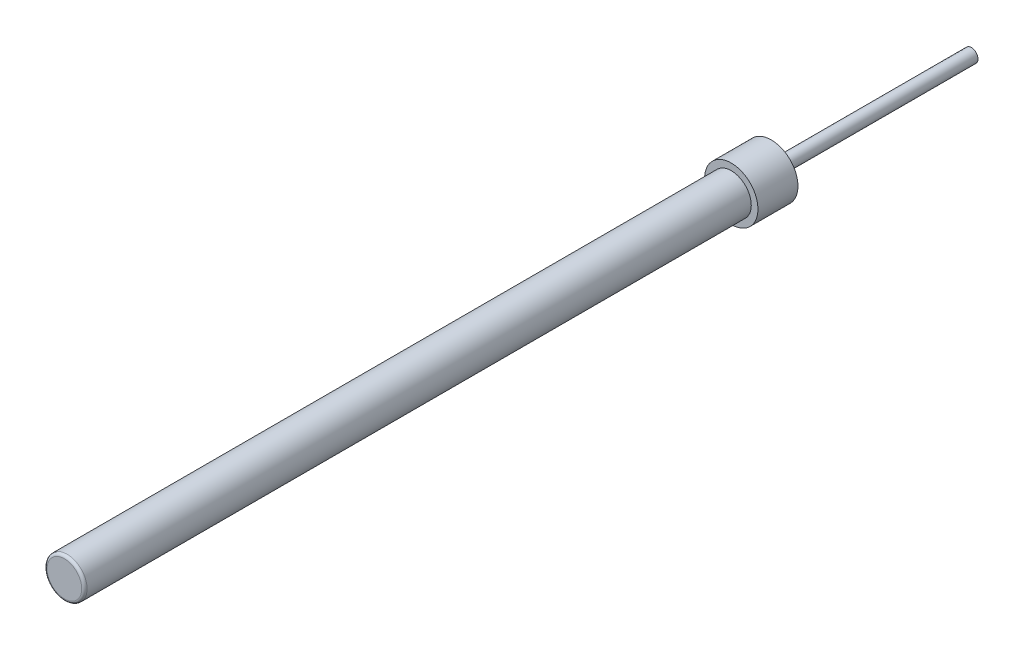
ISO-10303-21;
HEADER;
FILE_DESCRIPTION(('STEP AP214'),'2;1');
FILE_NAME('part.step','',(''),(''),'','','');
FILE_SCHEMA(('AUTOMOTIVE_DESIGN { 1 0 10303 214 1 1 1 1 }'));
ENDSEC;
DATA;
#1=APPLICATION_CONTEXT('core data for automotive mechanical design processes');
#2=APPLICATION_PROTOCOL_DEFINITION('international standard','automotive_design',2000,#1);
#3=PRODUCT_CONTEXT('',#1,'mechanical');
#4=PRODUCT('Part','Part','',(#3));
#5=PRODUCT_RELATED_PRODUCT_CATEGORY('part','',(#4));
#6=PRODUCT_DEFINITION_FORMATION('','',#4);
#7=PRODUCT_DEFINITION_CONTEXT('part definition',#1,'design');
#8=PRODUCT_DEFINITION('design','',#6,#7);
#9=PRODUCT_DEFINITION_SHAPE('','',#8);
#10=(LENGTH_UNIT() NAMED_UNIT(*) SI_UNIT(.MILLI.,.METRE.));
#11=(NAMED_UNIT(*) PLANE_ANGLE_UNIT() SI_UNIT($,.RADIAN.));
#12=(NAMED_UNIT(*) SI_UNIT($,.STERADIAN.) SOLID_ANGLE_UNIT());
#13=UNCERTAINTY_MEASURE_WITH_UNIT(LENGTH_MEASURE(1.E-05),#10,'distance_accuracy_value','');
#14=(GEOMETRIC_REPRESENTATION_CONTEXT(3) GLOBAL_UNCERTAINTY_ASSIGNED_CONTEXT((#13)) GLOBAL_UNIT_ASSIGNED_CONTEXT((#10,
#11,#12)) REPRESENTATION_CONTEXT('',''));
#15=CARTESIAN_POINT('',(0.,0.,0.));
#16=DIRECTION('',(0.,0.,1.));
#17=DIRECTION('',(1.,0.,0.));
#18=AXIS2_PLACEMENT_3D('',#15,#16,#17);
#19=CARTESIAN_POINT('',(0.,0.,49.8));
#20=DIRECTION('',(0.,0.,1.));
#21=DIRECTION('',(1.,0.,0.));
#22=AXIS2_PLACEMENT_3D('',#19,#20,#21);
#23=TOROIDAL_SURFACE('',#22,1.3,0.2);
#24=CARTESIAN_POINT('',(0.,0.,50.));
#25=DIRECTION('',(0.,0.,1.));
#26=DIRECTION('',(1.,0.,0.));
#27=AXIS2_PLACEMENT_3D('',#24,#25,#26);
#28=CIRCLE('',#27,1.3);
#29=CARTESIAN_POINT('',(1.3,0.,50.));
#30=VERTEX_POINT('',#29);
#31=EDGE_CURVE('E50',#30,#30,#28,.T.);
#32=ORIENTED_EDGE('',*,*,#31,.F.);
#33=EDGE_LOOP('',(#32));
#34=FACE_BOUND('',#33,.T.);
#35=CARTESIAN_POINT('',(0.,0.,49.8));
#36=DIRECTION('',(0.,0.,1.));
#37=DIRECTION('',(1.,0.,0.));
#38=AXIS2_PLACEMENT_3D('',#35,#36,#37);
#39=CIRCLE('',#38,1.5);
#40=CARTESIAN_POINT('',(1.5,0.,49.8));
#41=VERTEX_POINT('',#40);
#42=EDGE_CURVE('E40',#41,#41,#39,.F.);
#43=ORIENTED_EDGE('',*,*,#42,.F.);
#44=EDGE_LOOP('',(#43));
#45=FACE_BOUND('',#44,.T.);
#46=ADVANCED_FACE('F37',(#34,#45),#23,.T.);
#47=CARTESIAN_POINT('',(0.,0.,50.));
#48=DIRECTION('',(0.,0.,-1.));
#49=DIRECTION('',(-1.,0.,0.));
#50=AXIS2_PLACEMENT_3D('',#47,#48,#49);
#51=CYLINDRICAL_SURFACE('',#50,1.5);
#52=ORIENTED_EDGE('',*,*,#42,.T.);
#53=EDGE_LOOP('',(#52));
#54=FACE_BOUND('',#53,.T.);
#55=CARTESIAN_POINT('',(0.,0.,0.));
#56=DIRECTION('',(0.,0.,1.));
#57=DIRECTION('',(1.,0.,0.));
#58=AXIS2_PLACEMENT_3D('',#55,#56,#57);
#59=CIRCLE('',#58,1.5);
#60=CARTESIAN_POINT('',(1.5,0.,0.));
#61=VERTEX_POINT('',#60);
#62=EDGE_CURVE('E58',#61,#61,#59,.T.);
#63=ORIENTED_EDGE('',*,*,#62,.T.);
#64=EDGE_LOOP('',(#63));
#65=FACE_BOUND('',#64,.T.);
#66=ADVANCED_FACE('F73',(#54,#65),#51,.T.);
#67=CARTESIAN_POINT('',(0.,0.,50.));
#68=DIRECTION('',(0.,0.,1.));
#69=DIRECTION('',(1.,0.,0.));
#70=AXIS2_PLACEMENT_3D('',#67,#68,#69);
#71=PLANE('',#70);
#72=ORIENTED_EDGE('',*,*,#31,.T.);
#73=EDGE_LOOP('',(#72));
#74=FACE_BOUND('',#73,.T.);
#75=ADVANCED_FACE('F69',(#74),#71,.T.);
#76=CARTESIAN_POINT('',(0.,0.,-3.));
#77=DIRECTION('',(0.,0.,1.));
#78=DIRECTION('',(1.,0.,0.));
#79=AXIS2_PLACEMENT_3D('',#76,#77,#78);
#80=CYLINDRICAL_SURFACE('',#79,2.);
#81=CARTESIAN_POINT('',(0.,0.,-3.));
#82=DIRECTION('',(0.,0.,-1.));
#83=DIRECTION('',(-1.,0.,0.));
#84=AXIS2_PLACEMENT_3D('',#81,#82,#83);
#85=CIRCLE('',#84,2.);
#86=CARTESIAN_POINT('',(-2.,0.,-3.));
#87=VERTEX_POINT('',#86);
#88=EDGE_CURVE('E54',#87,#87,#85,.T.);
#89=ORIENTED_EDGE('',*,*,#88,.F.);
#90=EDGE_LOOP('',(#89));
#91=FACE_BOUND('',#90,.T.);
#92=CARTESIAN_POINT('',(0.,0.,0.));
#93=DIRECTION('',(0.,0.,-1.));
#94=DIRECTION('',(-1.,0.,0.));
#95=AXIS2_PLACEMENT_3D('',#92,#93,#94);
#96=CIRCLE('',#95,2.);
#97=CARTESIAN_POINT('',(-2.,0.,0.));
#98=VERTEX_POINT('',#97);
#99=EDGE_CURVE('E59',#98,#98,#96,.T.);
#100=ORIENTED_EDGE('',*,*,#99,.T.);
#101=EDGE_LOOP('',(#100));
#102=FACE_BOUND('',#101,.T.);
#103=ADVANCED_FACE('F88',(#91,#102),#80,.T.);
#104=CARTESIAN_POINT('',(0.,0.,-3.));
#105=DIRECTION('',(0.,0.,-1.));
#106=DIRECTION('',(-1.,0.,0.));
#107=AXIS2_PLACEMENT_3D('',#104,#105,#106);
#108=PLANE('',#107);
#109=CARTESIAN_POINT('',(0.,0.,-3.));
#110=DIRECTION('',(0.,0.,-1.));
#111=DIRECTION('',(-1.,0.,0.));
#112=AXIS2_PLACEMENT_3D('',#109,#110,#111);
#113=CIRCLE('',#112,0.5);
#114=CARTESIAN_POINT('',(-0.5,0.,-3.));
#115=VERTEX_POINT('',#114);
#116=EDGE_CURVE('E10',#115,#115,#113,.T.);
#117=ORIENTED_EDGE('',*,*,#116,.F.);
#118=EDGE_LOOP('',(#117));
#119=FACE_BOUND('',#118,.T.);
#120=ORIENTED_EDGE('',*,*,#88,.T.);
#121=EDGE_LOOP('',(#120));
#122=FACE_BOUND('',#121,.T.);
#123=ADVANCED_FACE('F84',(#119,#122),#108,.T.);
#124=CARTESIAN_POINT('',(0.,0.,0.));
#125=DIRECTION('',(0.,0.,-1.));
#126=DIRECTION('',(-1.,0.,0.));
#127=AXIS2_PLACEMENT_3D('',#124,#125,#126);
#128=PLANE('',#127);
#129=ORIENTED_EDGE('',*,*,#62,.F.);
#130=EDGE_LOOP('',(#129));
#131=FACE_BOUND('',#130,.T.);
#132=ORIENTED_EDGE('',*,*,#99,.F.);
#133=EDGE_LOOP('',(#132));
#134=FACE_BOUND('',#133,.T.);
#135=ADVANCED_FACE('F80',(#131,#134),#128,.F.);
#136=CARTESIAN_POINT('',(0.,0.,-18.));
#137=DIRECTION('',(0.,0.,1.));
#138=DIRECTION('',(1.,0.,0.));
#139=AXIS2_PLACEMENT_3D('',#136,#137,#138);
#140=CYLINDRICAL_SURFACE('',#139,0.5);
#141=CARTESIAN_POINT('',(0.,0.,-18.));
#142=DIRECTION('',(0.,0.,-1.));
#143=DIRECTION('',(-1.,0.,0.));
#144=AXIS2_PLACEMENT_3D('',#141,#142,#143);
#145=CIRCLE('',#144,0.5);
#146=CARTESIAN_POINT('',(-0.5,0.,-18.));
#147=VERTEX_POINT('',#146);
#148=EDGE_CURVE('E53',#147,#147,#145,.T.);
#149=ORIENTED_EDGE('',*,*,#148,.F.);
#150=EDGE_LOOP('',(#149));
#151=FACE_BOUND('',#150,.T.);
#152=ORIENTED_EDGE('',*,*,#116,.T.);
#153=EDGE_LOOP('',(#152));
#154=FACE_BOUND('',#153,.T.);
#155=ADVANCED_FACE('F83',(#151,#154),#140,.T.);
#156=CARTESIAN_POINT('',(0.,0.,-18.));
#157=DIRECTION('',(0.,0.,-1.));
#158=DIRECTION('',(-1.,0.,0.));
#159=AXIS2_PLACEMENT_3D('',#156,#157,#158);
#160=PLANE('',#159);
#161=ORIENTED_EDGE('',*,*,#148,.T.);
#162=EDGE_LOOP('',(#161));
#163=FACE_BOUND('',#162,.T.);
#164=ADVANCED_FACE('F103',(#163),#160,.T.);
#165=CLOSED_SHELL('',(#46,#66,#75,#103,#123,#135,#155,#164));
#166=MANIFOLD_SOLID_BREP('B2',#165);
#167=ADVANCED_BREP_SHAPE_REPRESENTATION('',(#18,#166),#14);
#168=SHAPE_DEFINITION_REPRESENTATION(#9,#167);
ENDSEC;
END-ISO-10303-21;
